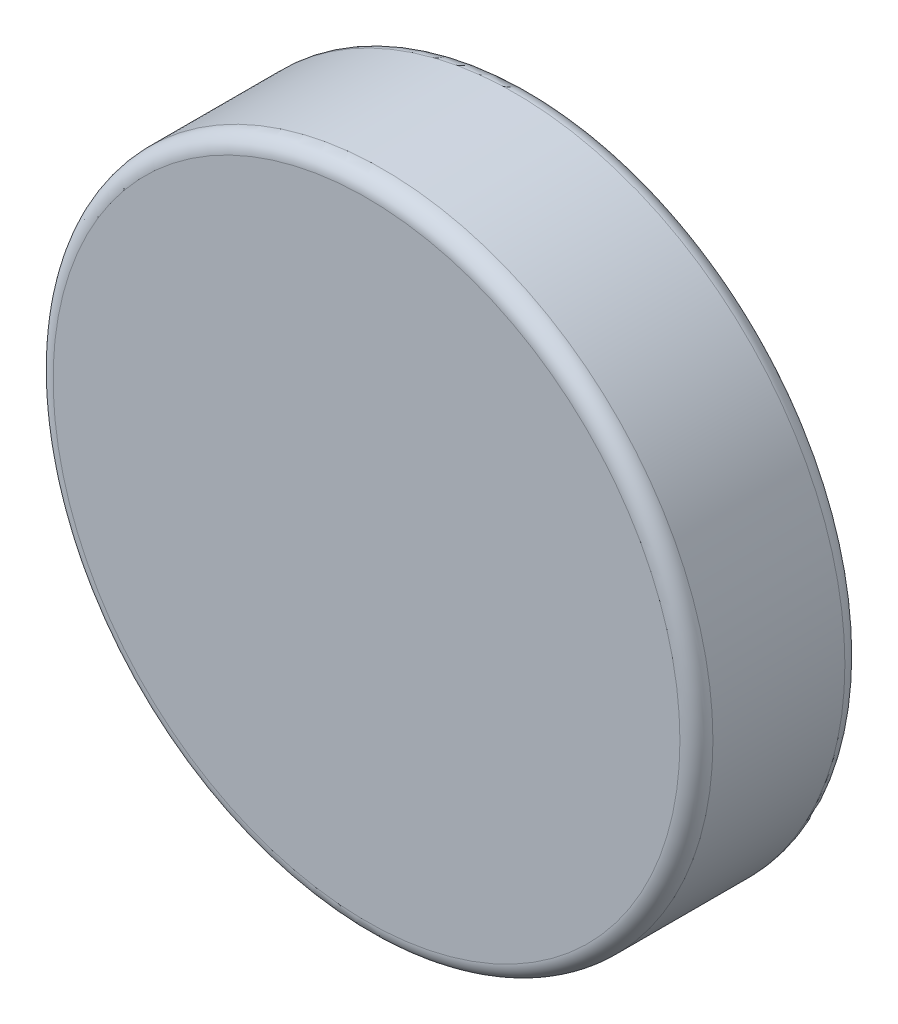
ISO-10303-21;
HEADER;
FILE_DESCRIPTION(('STEP AP214'),'2;1');
FILE_NAME('part.step','',(''),(''),'','','');
FILE_SCHEMA(('AUTOMOTIVE_DESIGN { 1 0 10303 214 1 1 1 1 }'));
ENDSEC;
DATA;
#1=APPLICATION_CONTEXT('core data for automotive mechanical design processes');
#2=APPLICATION_PROTOCOL_DEFINITION('international standard','automotive_design',2000,#1);
#3=PRODUCT_CONTEXT('',#1,'mechanical');
#4=PRODUCT('Part','Part','',(#3));
#5=PRODUCT_RELATED_PRODUCT_CATEGORY('part','',(#4));
#6=PRODUCT_DEFINITION_FORMATION('','',#4);
#7=PRODUCT_DEFINITION_CONTEXT('part definition',#1,'design');
#8=PRODUCT_DEFINITION('design','',#6,#7);
#9=PRODUCT_DEFINITION_SHAPE('','',#8);
#10=(LENGTH_UNIT() NAMED_UNIT(*) SI_UNIT(.MILLI.,.METRE.));
#11=(NAMED_UNIT(*) PLANE_ANGLE_UNIT() SI_UNIT($,.RADIAN.));
#12=(NAMED_UNIT(*) SI_UNIT($,.STERADIAN.) SOLID_ANGLE_UNIT());
#13=UNCERTAINTY_MEASURE_WITH_UNIT(LENGTH_MEASURE(1.E-05),#10,'distance_accuracy_value','');
#14=(GEOMETRIC_REPRESENTATION_CONTEXT(3) GLOBAL_UNCERTAINTY_ASSIGNED_CONTEXT((#13)) GLOBAL_UNIT_ASSIGNED_CONTEXT((#10,
#11,#12)) REPRESENTATION_CONTEXT('',''));
#15=CARTESIAN_POINT('',(0.,0.,0.));
#16=DIRECTION('',(0.,0.,1.));
#17=DIRECTION('',(1.,0.,0.));
#18=AXIS2_PLACEMENT_3D('',#15,#16,#17);
#19=CARTESIAN_POINT('',(0.,0.,1.5));
#20=DIRECTION('',(0.,0.,-1.));
#21=DIRECTION('',(-1.,0.,0.));
#22=AXIS2_PLACEMENT_3D('',#19,#20,#21);
#23=CYLINDRICAL_SURFACE('',#22,3.);
#24=CARTESIAN_POINT('',(0.,0.,0.15));
#25=DIRECTION('',(0.,0.,1.));
#26=DIRECTION('',(1.,0.,0.));
#27=AXIS2_PLACEMENT_3D('',#24,#25,#26);
#28=CIRCLE('',#27,3.);
#29=CARTESIAN_POINT('',(3.,0.,0.15));
#30=VERTEX_POINT('',#29);
#31=EDGE_CURVE('E46',#30,#30,#28,.T.);
#32=ORIENTED_EDGE('',*,*,#31,.T.);
#33=EDGE_LOOP('',(#32));
#34=FACE_BOUND('',#33,.T.);
#35=CARTESIAN_POINT('',(0.,0.,1.35));
#36=DIRECTION('',(0.,0.,1.));
#37=DIRECTION('',(1.,0.,0.));
#38=AXIS2_PLACEMENT_3D('',#35,#36,#37);
#39=CIRCLE('',#38,3.);
#40=CARTESIAN_POINT('',(3.,0.,1.35));
#41=VERTEX_POINT('',#40);
#42=EDGE_CURVE('E50',#41,#41,#39,.F.);
#43=ORIENTED_EDGE('',*,*,#42,.T.);
#44=EDGE_LOOP('',(#43));
#45=FACE_BOUND('',#44,.T.);
#46=ADVANCED_FACE('F35',(#34,#45),#23,.T.);
#47=CARTESIAN_POINT('',(0.,0.,1.5));
#48=DIRECTION('',(0.,0.,1.));
#49=DIRECTION('',(1.,0.,0.));
#50=AXIS2_PLACEMENT_3D('',#47,#48,#49);
#51=PLANE('',#50);
#52=CARTESIAN_POINT('',(0.,0.,1.5));
#53=DIRECTION('',(0.,0.,1.));
#54=DIRECTION('',(1.,0.,0.));
#55=AXIS2_PLACEMENT_3D('',#52,#53,#54);
#56=CIRCLE('',#55,2.85);
#57=CARTESIAN_POINT('',(2.85,0.,1.5));
#58=VERTEX_POINT('',#57);
#59=EDGE_CURVE('E10',#58,#58,#56,.T.);
#60=ORIENTED_EDGE('',*,*,#59,.T.);
#61=EDGE_LOOP('',(#60));
#62=FACE_BOUND('',#61,.T.);
#63=ADVANCED_FACE('F66',(#62),#51,.T.);
#64=CARTESIAN_POINT('',(0.,0.,0.));
#65=DIRECTION('',(0.,0.,1.));
#66=DIRECTION('',(1.,0.,0.));
#67=AXIS2_PLACEMENT_3D('',#64,#65,#66);
#68=PLANE('',#67);
#69=CARTESIAN_POINT('',(0.,0.,0.));
#70=DIRECTION('',(0.,0.,1.));
#71=DIRECTION('',(1.,0.,0.));
#72=AXIS2_PLACEMENT_3D('',#69,#70,#71);
#73=CIRCLE('',#72,2.85);
#74=CARTESIAN_POINT('',(2.85,0.,0.));
#75=VERTEX_POINT('',#74);
#76=EDGE_CURVE('E42',#75,#75,#73,.F.);
#77=ORIENTED_EDGE('',*,*,#76,.T.);
#78=EDGE_LOOP('',(#77));
#79=FACE_BOUND('',#78,.T.);
#80=ADVANCED_FACE('F63',(#79),#68,.F.);
#81=CARTESIAN_POINT('',(0.,0.,0.15));
#82=DIRECTION('',(0.,0.,1.));
#83=DIRECTION('',(1.,0.,0.));
#84=AXIS2_PLACEMENT_3D('',#81,#82,#83);
#85=TOROIDAL_SURFACE('',#84,2.85,0.15);
#86=ORIENTED_EDGE('',*,*,#76,.F.);
#87=EDGE_LOOP('',(#86));
#88=FACE_BOUND('',#87,.T.);
#89=ORIENTED_EDGE('',*,*,#31,.F.);
#90=EDGE_LOOP('',(#89));
#91=FACE_BOUND('',#90,.T.);
#92=ADVANCED_FACE('F59',(#88,#91),#85,.T.);
#93=CARTESIAN_POINT('',(0.,0.,1.35));
#94=DIRECTION('',(0.,0.,1.));
#95=DIRECTION('',(1.,0.,0.));
#96=AXIS2_PLACEMENT_3D('',#93,#94,#95);
#97=TOROIDAL_SURFACE('',#96,2.85,0.15);
#98=ORIENTED_EDGE('',*,*,#42,.F.);
#99=EDGE_LOOP('',(#98));
#100=FACE_BOUND('',#99,.T.);
#101=ORIENTED_EDGE('',*,*,#59,.F.);
#102=EDGE_LOOP('',(#101));
#103=FACE_BOUND('',#102,.T.);
#104=ADVANCED_FACE('F37',(#100,#103),#97,.T.);
#105=CLOSED_SHELL('',(#46,#63,#80,#92,#104));
#106=MANIFOLD_SOLID_BREP('B2',#105);
#107=ADVANCED_BREP_SHAPE_REPRESENTATION('',(#18,#106),#14);
#108=SHAPE_DEFINITION_REPRESENTATION(#9,#107);
ENDSEC;
END-ISO-10303-21;
